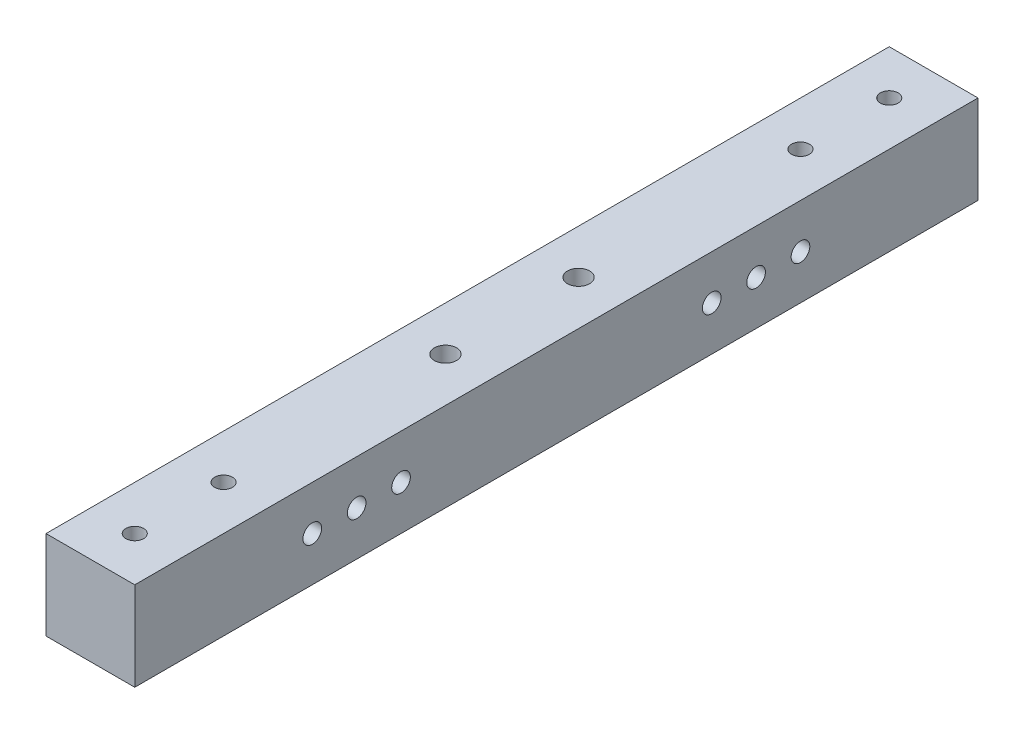
ISO-10303-21;
HEADER;
FILE_DESCRIPTION(('STEP AP214'),'2;1');
FILE_NAME('part.step','',(''),(''),'','','');
FILE_SCHEMA(('AUTOMOTIVE_DESIGN { 1 0 10303 214 1 1 1 1 }'));
ENDSEC;
DATA;
#1=APPLICATION_CONTEXT('core data for automotive mechanical design processes');
#2=APPLICATION_PROTOCOL_DEFINITION('international standard','automotive_design',2000,#1);
#3=PRODUCT_CONTEXT('',#1,'mechanical');
#4=PRODUCT('Part','Part','',(#3));
#5=PRODUCT_RELATED_PRODUCT_CATEGORY('part','',(#4));
#6=PRODUCT_DEFINITION_FORMATION('','',#4);
#7=PRODUCT_DEFINITION_CONTEXT('part definition',#1,'design');
#8=PRODUCT_DEFINITION('design','',#6,#7);
#9=PRODUCT_DEFINITION_SHAPE('','',#8);
#10=(LENGTH_UNIT() NAMED_UNIT(*) SI_UNIT(.MILLI.,.METRE.));
#11=(NAMED_UNIT(*) PLANE_ANGLE_UNIT() SI_UNIT($,.RADIAN.));
#12=(NAMED_UNIT(*) SI_UNIT($,.STERADIAN.) SOLID_ANGLE_UNIT());
#13=UNCERTAINTY_MEASURE_WITH_UNIT(LENGTH_MEASURE(1.E-05),#10,'distance_accuracy_value','');
#14=(GEOMETRIC_REPRESENTATION_CONTEXT(3) GLOBAL_UNCERTAINTY_ASSIGNED_CONTEXT((#13)) GLOBAL_UNIT_ASSIGNED_CONTEXT((#10,
#11,#12)) REPRESENTATION_CONTEXT('',''));
#15=CARTESIAN_POINT('',(0.,0.,0.));
#16=DIRECTION('',(0.,0.,1.));
#17=DIRECTION('',(1.,0.,0.));
#18=AXIS2_PLACEMENT_3D('',#15,#16,#17);
#19=CARTESIAN_POINT('',(0.,0.,190.));
#20=DIRECTION('',(1.,0.,0.));
#21=DIRECTION('',(0.,0.,-1.));
#22=AXIS2_PLACEMENT_3D('',#19,#20,#21);
#23=PLANE('',#22);
#24=CARTESIAN_POINT('',(0.,10.,40.));
#25=DIRECTION('',(1.,0.,0.));
#26=DIRECTION('',(0.,0.,1.));
#27=AXIS2_PLACEMENT_3D('',#24,#25,#26);
#28=CIRCLE('',#27,2.09999999999999);
#29=CARTESIAN_POINT('',(0.,10.,42.1));
#30=VERTEX_POINT('',#29);
#31=EDGE_CURVE('E158',#30,#30,#28,.T.);
#32=ORIENTED_EDGE('',*,*,#31,.T.);
#33=EDGE_LOOP('',(#32));
#34=FACE_BOUND('',#33,.T.);
#35=CARTESIAN_POINT('',(0.,10.,50.));
#36=DIRECTION('',(1.,0.,0.));
#37=DIRECTION('',(0.,0.,1.));
#38=AXIS2_PLACEMENT_3D('',#35,#36,#37);
#39=CIRCLE('',#38,2.09999999999999);
#40=CARTESIAN_POINT('',(0.,10.,52.1));
#41=VERTEX_POINT('',#40);
#42=EDGE_CURVE('E164',#41,#41,#39,.T.);
#43=ORIENTED_EDGE('',*,*,#42,.T.);
#44=EDGE_LOOP('',(#43));
#45=FACE_BOUND('',#44,.T.);
#46=CARTESIAN_POINT('',(0.,10.0000000000002,60.));
#47=DIRECTION('',(1.,0.,0.));
#48=DIRECTION('',(0.,0.,1.));
#49=AXIS2_PLACEMENT_3D('',#46,#47,#48);
#50=CIRCLE('',#49,2.09999999999999);
#51=CARTESIAN_POINT('',(0.,10.0000000000002,62.1));
#52=VERTEX_POINT('',#51);
#53=EDGE_CURVE('E170',#52,#52,#50,.T.);
#54=ORIENTED_EDGE('',*,*,#53,.T.);
#55=EDGE_LOOP('',(#54));
#56=FACE_BOUND('',#55,.T.);
#57=CARTESIAN_POINT('',(0.,10.,150.));
#58=DIRECTION('',(1.,0.,0.));
#59=DIRECTION('',(0.,0.,-1.));
#60=AXIS2_PLACEMENT_3D('',#57,#58,#59);
#61=CIRCLE('',#60,2.09999999999999);
#62=CARTESIAN_POINT('',(0.,10.,147.9));
#63=VERTEX_POINT('',#62);
#64=EDGE_CURVE('E176',#63,#63,#61,.T.);
#65=ORIENTED_EDGE('',*,*,#64,.T.);
#66=EDGE_LOOP('',(#65));
#67=FACE_BOUND('',#66,.T.);
#68=CARTESIAN_POINT('',(0.,10.0000000000001,130.));
#69=DIRECTION('',(1.,0.,0.));
#70=DIRECTION('',(0.,0.,-1.));
#71=AXIS2_PLACEMENT_3D('',#68,#69,#70);
#72=CIRCLE('',#71,2.09999999999999);
#73=CARTESIAN_POINT('',(0.,10.0000000000001,127.9));
#74=VERTEX_POINT('',#73);
#75=EDGE_CURVE('E152',#74,#74,#72,.T.);
#76=ORIENTED_EDGE('',*,*,#75,.T.);
#77=EDGE_LOOP('',(#76));
#78=FACE_BOUND('',#77,.T.);
#79=CARTESIAN_POINT('',(0.,10.,140.));
#80=DIRECTION('',(1.,0.,0.));
#81=DIRECTION('',(0.,0.,-1.));
#82=AXIS2_PLACEMENT_3D('',#79,#80,#81);
#83=CIRCLE('',#82,2.09999999999999);
#84=CARTESIAN_POINT('',(0.,10.,137.9));
#85=VERTEX_POINT('',#84);
#86=EDGE_CURVE('E142',#85,#85,#83,.T.);
#87=ORIENTED_EDGE('',*,*,#86,.T.);
#88=EDGE_LOOP('',(#87));
#89=FACE_BOUND('',#88,.T.);
#90=DIRECTION('',(0.,-1.,0.));
#91=VECTOR('',#90,1.);
#92=CARTESIAN_POINT('',(0.,0.,0.));
#93=LINE('',#92,#91);
#94=CARTESIAN_POINT('',(0.,20.,0.));
#95=VERTEX_POINT('',#94);
#96=CARTESIAN_POINT('',(0.,0.,0.));
#97=VERTEX_POINT('',#96);
#98=EDGE_CURVE('E99',#95,#97,#93,.T.);
#99=ORIENTED_EDGE('',*,*,#98,.T.);
#100=DIRECTION('',(0.,0.,-1.));
#101=VECTOR('',#100,1.);
#102=CARTESIAN_POINT('',(0.,0.,190.));
#103=LINE('',#102,#101);
#104=CARTESIAN_POINT('',(0.,0.,190.));
#105=VERTEX_POINT('',#104);
#106=EDGE_CURVE('E11',#105,#97,#103,.T.);
#107=ORIENTED_EDGE('',*,*,#106,.F.);
#108=DIRECTION('',(0.,-1.,0.));
#109=VECTOR('',#108,1.);
#110=CARTESIAN_POINT('',(0.,0.,190.));
#111=LINE('',#110,#109);
#112=CARTESIAN_POINT('',(0.,20.,190.));
#113=VERTEX_POINT('',#112);
#114=EDGE_CURVE('E87',#113,#105,#111,.T.);
#115=ORIENTED_EDGE('',*,*,#114,.F.);
#116=DIRECTION('',(0.,0.,-1.));
#117=VECTOR('',#116,1.);
#118=CARTESIAN_POINT('',(0.,20.,190.));
#119=LINE('',#118,#117);
#120=EDGE_CURVE('E95',#113,#95,#119,.T.);
#121=ORIENTED_EDGE('',*,*,#120,.T.);
#122=EDGE_LOOP('',(#99,#107,#115,#121));
#123=FACE_BOUND('',#122,.T.);
#124=ADVANCED_FACE('F36',(#34,#45,#56,#67,#78,#89,#123),#23,.F.);
#125=CARTESIAN_POINT('',(0.,0.,190.));
#126=DIRECTION('',(0.,1.,0.));
#127=DIRECTION('',(0.,0.,1.));
#128=AXIS2_PLACEMENT_3D('',#125,#126,#127);
#129=PLANE('',#128);
#130=CARTESIAN_POINT('',(10.,0.,180.));
#131=DIRECTION('',(0.,1.,0.));
#132=DIRECTION('',(0.,0.,1.));
#133=AXIS2_PLACEMENT_3D('',#130,#131,#132);
#134=CIRCLE('',#133,2.);
#135=CARTESIAN_POINT('',(10.,0.,182.));
#136=VERTEX_POINT('',#135);
#137=EDGE_CURVE('E102',#136,#136,#134,.T.);
#138=ORIENTED_EDGE('',*,*,#137,.T.);
#139=EDGE_LOOP('',(#138));
#140=FACE_BOUND('',#139,.T.);
#141=CARTESIAN_POINT('',(10.,0.,80.));
#142=DIRECTION('',(0.,1.,0.));
#143=DIRECTION('',(0.,0.,-1.));
#144=AXIS2_PLACEMENT_3D('',#141,#142,#143);
#145=CIRCLE('',#144,2.5);
#146=CARTESIAN_POINT('',(10.,0.,77.5));
#147=VERTEX_POINT('',#146);
#148=EDGE_CURVE('E117',#147,#147,#145,.T.);
#149=ORIENTED_EDGE('',*,*,#148,.T.);
#150=EDGE_LOOP('',(#149));
#151=FACE_BOUND('',#150,.T.);
#152=CARTESIAN_POINT('',(10.,0.,30.));
#153=DIRECTION('',(0.,1.,0.));
#154=DIRECTION('',(0.,0.,-1.));
#155=AXIS2_PLACEMENT_3D('',#152,#153,#154);
#156=CIRCLE('',#155,2.);
#157=CARTESIAN_POINT('',(10.,0.,28.));
#158=VERTEX_POINT('',#157);
#159=EDGE_CURVE('E116',#158,#158,#156,.T.);
#160=ORIENTED_EDGE('',*,*,#159,.T.);
#161=EDGE_LOOP('',(#160));
#162=FACE_BOUND('',#161,.T.);
#163=CARTESIAN_POINT('',(10.,0.,10.));
#164=DIRECTION('',(0.,1.,0.));
#165=DIRECTION('',(0.,0.,-1.));
#166=AXIS2_PLACEMENT_3D('',#163,#164,#165);
#167=CIRCLE('',#166,2.);
#168=CARTESIAN_POINT('',(10.,0.,8.00000000000001));
#169=VERTEX_POINT('',#168);
#170=EDGE_CURVE('E123',#169,#169,#167,.T.);
#171=ORIENTED_EDGE('',*,*,#170,.T.);
#172=EDGE_LOOP('',(#171));
#173=FACE_BOUND('',#172,.T.);
#174=CARTESIAN_POINT('',(10.,0.,110.));
#175=DIRECTION('',(0.,1.,0.));
#176=DIRECTION('',(0.,0.,1.));
#177=AXIS2_PLACEMENT_3D('',#174,#175,#176);
#178=CIRCLE('',#177,2.5);
#179=CARTESIAN_POINT('',(10.,0.,112.5));
#180=VERTEX_POINT('',#179);
#181=EDGE_CURVE('E129',#180,#180,#178,.T.);
#182=ORIENTED_EDGE('',*,*,#181,.T.);
#183=EDGE_LOOP('',(#182));
#184=FACE_BOUND('',#183,.T.);
#185=CARTESIAN_POINT('',(10.,0.,160.));
#186=DIRECTION('',(0.,1.,0.));
#187=DIRECTION('',(0.,0.,1.));
#188=AXIS2_PLACEMENT_3D('',#185,#186,#187);
#189=CIRCLE('',#188,2.);
#190=CARTESIAN_POINT('',(10.,0.,162.));
#191=VERTEX_POINT('',#190);
#192=EDGE_CURVE('E135',#191,#191,#189,.T.);
#193=ORIENTED_EDGE('',*,*,#192,.T.);
#194=EDGE_LOOP('',(#193));
#195=FACE_BOUND('',#194,.T.);
#196=DIRECTION('',(1.,0.,0.));
#197=VECTOR('',#196,1.);
#198=CARTESIAN_POINT('',(0.,0.,0.));
#199=LINE('',#198,#197);
#200=CARTESIAN_POINT('',(20.,0.,0.));
#201=VERTEX_POINT('',#200);
#202=EDGE_CURVE('E91',#97,#201,#199,.T.);
#203=ORIENTED_EDGE('',*,*,#202,.T.);
#204=DIRECTION('',(0.,0.,-1.));
#205=VECTOR('',#204,1.);
#206=CARTESIAN_POINT('',(20.,0.,190.));
#207=LINE('',#206,#205);
#208=CARTESIAN_POINT('',(20.,0.,190.));
#209=VERTEX_POINT('',#208);
#210=EDGE_CURVE('E44',#209,#201,#207,.T.);
#211=ORIENTED_EDGE('',*,*,#210,.F.);
#212=DIRECTION('',(1.,0.,0.));
#213=VECTOR('',#212,1.);
#214=CARTESIAN_POINT('',(0.,0.,190.));
#215=LINE('',#214,#213);
#216=EDGE_CURVE('E82',#105,#209,#215,.T.);
#217=ORIENTED_EDGE('',*,*,#216,.F.);
#218=ORIENTED_EDGE('',*,*,#106,.T.);
#219=EDGE_LOOP('',(#203,#211,#217,#218));
#220=FACE_BOUND('',#219,.T.);
#221=ADVANCED_FACE('F90',(#140,#151,#162,#173,#184,#195,#220),#129,.F.);
#222=CARTESIAN_POINT('',(20.,0.,190.));
#223=DIRECTION('',(-1.,0.,0.));
#224=DIRECTION('',(0.,0.,1.));
#225=AXIS2_PLACEMENT_3D('',#222,#223,#224);
#226=PLANE('',#225);
#227=CARTESIAN_POINT('',(20.,10.,40.));
#228=DIRECTION('',(1.,0.,0.));
#229=DIRECTION('',(0.,0.,1.));
#230=AXIS2_PLACEMENT_3D('',#227,#228,#229);
#231=CIRCLE('',#230,2.09999999999999);
#232=CARTESIAN_POINT('',(20.,10.,42.1));
#233=VERTEX_POINT('',#232);
#234=EDGE_CURVE('E155',#233,#233,#231,.T.);
#235=ORIENTED_EDGE('',*,*,#234,.F.);
#236=EDGE_LOOP('',(#235));
#237=FACE_BOUND('',#236,.T.);
#238=CARTESIAN_POINT('',(20.,10.,50.));
#239=DIRECTION('',(1.,0.,0.));
#240=DIRECTION('',(0.,0.,1.));
#241=AXIS2_PLACEMENT_3D('',#238,#239,#240);
#242=CIRCLE('',#241,2.09999999999999);
#243=CARTESIAN_POINT('',(20.,10.,52.1));
#244=VERTEX_POINT('',#243);
#245=EDGE_CURVE('E161',#244,#244,#242,.T.);
#246=ORIENTED_EDGE('',*,*,#245,.F.);
#247=EDGE_LOOP('',(#246));
#248=FACE_BOUND('',#247,.T.);
#249=CARTESIAN_POINT('',(20.,10.0000000000002,60.));
#250=DIRECTION('',(1.,0.,0.));
#251=DIRECTION('',(0.,0.,1.));
#252=AXIS2_PLACEMENT_3D('',#249,#250,#251);
#253=CIRCLE('',#252,2.09999999999999);
#254=CARTESIAN_POINT('',(20.,10.0000000000002,62.1));
#255=VERTEX_POINT('',#254);
#256=EDGE_CURVE('E167',#255,#255,#253,.T.);
#257=ORIENTED_EDGE('',*,*,#256,.F.);
#258=EDGE_LOOP('',(#257));
#259=FACE_BOUND('',#258,.T.);
#260=CARTESIAN_POINT('',(20.,10.,150.));
#261=DIRECTION('',(1.,0.,0.));
#262=DIRECTION('',(0.,0.,-1.));
#263=AXIS2_PLACEMENT_3D('',#260,#261,#262);
#264=CIRCLE('',#263,2.09999999999999);
#265=CARTESIAN_POINT('',(20.,10.,147.9));
#266=VERTEX_POINT('',#265);
#267=EDGE_CURVE('E173',#266,#266,#264,.T.);
#268=ORIENTED_EDGE('',*,*,#267,.F.);
#269=EDGE_LOOP('',(#268));
#270=FACE_BOUND('',#269,.T.);
#271=CARTESIAN_POINT('',(20.,10.0000000000001,130.));
#272=DIRECTION('',(1.,0.,0.));
#273=DIRECTION('',(0.,0.,-1.));
#274=AXIS2_PLACEMENT_3D('',#271,#272,#273);
#275=CIRCLE('',#274,2.09999999999999);
#276=CARTESIAN_POINT('',(20.,10.0000000000001,127.9));
#277=VERTEX_POINT('',#276);
#278=EDGE_CURVE('E179',#277,#277,#275,.T.);
#279=ORIENTED_EDGE('',*,*,#278,.F.);
#280=EDGE_LOOP('',(#279));
#281=FACE_BOUND('',#280,.T.);
#282=CARTESIAN_POINT('',(20.,10.,140.));
#283=DIRECTION('',(1.,0.,0.));
#284=DIRECTION('',(0.,0.,-1.));
#285=AXIS2_PLACEMENT_3D('',#282,#283,#284);
#286=CIRCLE('',#285,2.09999999999999);
#287=CARTESIAN_POINT('',(20.,10.,137.9));
#288=VERTEX_POINT('',#287);
#289=EDGE_CURVE('E149',#288,#288,#286,.T.);
#290=ORIENTED_EDGE('',*,*,#289,.F.);
#291=EDGE_LOOP('',(#290));
#292=FACE_BOUND('',#291,.T.);
#293=DIRECTION('',(0.,1.,0.));
#294=VECTOR('',#293,1.);
#295=CARTESIAN_POINT('',(20.,0.,0.));
#296=LINE('',#295,#294);
#297=CARTESIAN_POINT('',(20.,20.,0.));
#298=VERTEX_POINT('',#297);
#299=EDGE_CURVE('E69',#201,#298,#296,.T.);
#300=ORIENTED_EDGE('',*,*,#299,.T.);
#301=DIRECTION('',(0.,0.,-1.));
#302=VECTOR('',#301,1.);
#303=CARTESIAN_POINT('',(20.,20.,190.));
#304=LINE('',#303,#302);
#305=CARTESIAN_POINT('',(20.,20.,190.));
#306=VERTEX_POINT('',#305);
#307=EDGE_CURVE('E92',#306,#298,#304,.T.);
#308=ORIENTED_EDGE('',*,*,#307,.F.);
#309=DIRECTION('',(0.,1.,0.));
#310=VECTOR('',#309,1.);
#311=CARTESIAN_POINT('',(20.,0.,190.));
#312=LINE('',#311,#310);
#313=EDGE_CURVE('E85',#209,#306,#312,.T.);
#314=ORIENTED_EDGE('',*,*,#313,.F.);
#315=ORIENTED_EDGE('',*,*,#210,.T.);
#316=EDGE_LOOP('',(#300,#308,#314,#315));
#317=FACE_BOUND('',#316,.T.);
#318=ADVANCED_FACE('F93',(#237,#248,#259,#270,#281,#292,#317),#226,.F.);
#319=CARTESIAN_POINT('',(0.,20.,190.));
#320=DIRECTION('',(0.,-1.,0.));
#321=DIRECTION('',(0.,0.,-1.));
#322=AXIS2_PLACEMENT_3D('',#319,#320,#321);
#323=PLANE('',#322);
#324=CARTESIAN_POINT('',(10.,20.,180.));
#325=DIRECTION('',(0.,1.,0.));
#326=DIRECTION('',(0.,0.,1.));
#327=AXIS2_PLACEMENT_3D('',#324,#325,#326);
#328=CIRCLE('',#327,2.);
#329=CARTESIAN_POINT('',(10.,20.,182.));
#330=VERTEX_POINT('',#329);
#331=EDGE_CURVE('E138',#330,#330,#328,.T.);
#332=ORIENTED_EDGE('',*,*,#331,.F.);
#333=EDGE_LOOP('',(#332));
#334=FACE_BOUND('',#333,.T.);
#335=CARTESIAN_POINT('',(10.,20.,80.));
#336=DIRECTION('',(0.,1.,0.));
#337=DIRECTION('',(0.,0.,-1.));
#338=AXIS2_PLACEMENT_3D('',#335,#336,#337);
#339=CIRCLE('',#338,2.5);
#340=CARTESIAN_POINT('',(10.,20.,77.5));
#341=VERTEX_POINT('',#340);
#342=EDGE_CURVE('E139',#341,#341,#339,.T.);
#343=ORIENTED_EDGE('',*,*,#342,.F.);
#344=EDGE_LOOP('',(#343));
#345=FACE_BOUND('',#344,.T.);
#346=CARTESIAN_POINT('',(10.,20.,30.));
#347=DIRECTION('',(0.,1.,0.));
#348=DIRECTION('',(0.,0.,-1.));
#349=AXIS2_PLACEMENT_3D('',#346,#347,#348);
#350=CIRCLE('',#349,2.);
#351=CARTESIAN_POINT('',(10.,20.,28.));
#352=VERTEX_POINT('',#351);
#353=EDGE_CURVE('E113',#352,#352,#350,.T.);
#354=ORIENTED_EDGE('',*,*,#353,.F.);
#355=EDGE_LOOP('',(#354));
#356=FACE_BOUND('',#355,.T.);
#357=CARTESIAN_POINT('',(10.,20.,10.));
#358=DIRECTION('',(0.,1.,0.));
#359=DIRECTION('',(0.,0.,-1.));
#360=AXIS2_PLACEMENT_3D('',#357,#358,#359);
#361=CIRCLE('',#360,2.);
#362=CARTESIAN_POINT('',(10.,20.,8.00000000000001));
#363=VERTEX_POINT('',#362);
#364=EDGE_CURVE('E120',#363,#363,#361,.T.);
#365=ORIENTED_EDGE('',*,*,#364,.F.);
#366=EDGE_LOOP('',(#365));
#367=FACE_BOUND('',#366,.T.);
#368=CARTESIAN_POINT('',(10.,20.,110.));
#369=DIRECTION('',(0.,1.,0.));
#370=DIRECTION('',(0.,0.,1.));
#371=AXIS2_PLACEMENT_3D('',#368,#369,#370);
#372=CIRCLE('',#371,2.5);
#373=CARTESIAN_POINT('',(10.,20.,112.5));
#374=VERTEX_POINT('',#373);
#375=EDGE_CURVE('E126',#374,#374,#372,.T.);
#376=ORIENTED_EDGE('',*,*,#375,.F.);
#377=EDGE_LOOP('',(#376));
#378=FACE_BOUND('',#377,.T.);
#379=CARTESIAN_POINT('',(10.,20.,160.));
#380=DIRECTION('',(0.,1.,0.));
#381=DIRECTION('',(0.,0.,1.));
#382=AXIS2_PLACEMENT_3D('',#379,#380,#381);
#383=CIRCLE('',#382,2.);
#384=CARTESIAN_POINT('',(10.,20.,162.));
#385=VERTEX_POINT('',#384);
#386=EDGE_CURVE('E132',#385,#385,#383,.T.);
#387=ORIENTED_EDGE('',*,*,#386,.F.);
#388=EDGE_LOOP('',(#387));
#389=FACE_BOUND('',#388,.T.);
#390=DIRECTION('',(-1.,0.,0.));
#391=VECTOR('',#390,1.);
#392=CARTESIAN_POINT('',(0.,20.,0.));
#393=LINE('',#392,#391);
#394=EDGE_CURVE('E75',#298,#95,#393,.T.);
#395=ORIENTED_EDGE('',*,*,#394,.T.);
#396=ORIENTED_EDGE('',*,*,#120,.F.);
#397=DIRECTION('',(-1.,0.,0.));
#398=VECTOR('',#397,1.);
#399=CARTESIAN_POINT('',(0.,20.,190.));
#400=LINE('',#399,#398);
#401=EDGE_CURVE('E52',#306,#113,#400,.T.);
#402=ORIENTED_EDGE('',*,*,#401,.F.);
#403=ORIENTED_EDGE('',*,*,#307,.T.);
#404=EDGE_LOOP('',(#395,#396,#402,#403));
#405=FACE_BOUND('',#404,.T.);
#406=ADVANCED_FACE('F107',(#334,#345,#356,#367,#378,#389,#405),#323,.F.);
#407=CARTESIAN_POINT('',(0.,0.,190.));
#408=DIRECTION('',(0.,0.,-1.));
#409=DIRECTION('',(-1.,0.,0.));
#410=AXIS2_PLACEMENT_3D('',#407,#408,#409);
#411=PLANE('',#410);
#412=ORIENTED_EDGE('',*,*,#114,.T.);
#413=ORIENTED_EDGE('',*,*,#216,.T.);
#414=ORIENTED_EDGE('',*,*,#313,.T.);
#415=ORIENTED_EDGE('',*,*,#401,.T.);
#416=EDGE_LOOP('',(#412,#413,#414,#415));
#417=FACE_BOUND('',#416,.T.);
#418=ADVANCED_FACE('F83',(#417),#411,.F.);
#419=CARTESIAN_POINT('',(0.,0.,0.));
#420=DIRECTION('',(0.,0.,-1.));
#421=DIRECTION('',(-1.,0.,0.));
#422=AXIS2_PLACEMENT_3D('',#419,#420,#421);
#423=PLANE('',#422);
#424=ORIENTED_EDGE('',*,*,#98,.F.);
#425=ORIENTED_EDGE('',*,*,#394,.F.);
#426=ORIENTED_EDGE('',*,*,#299,.F.);
#427=ORIENTED_EDGE('',*,*,#202,.F.);
#428=EDGE_LOOP('',(#424,#425,#426,#427));
#429=FACE_BOUND('',#428,.T.);
#430=ADVANCED_FACE('F110',(#429),#423,.T.);
#431=CARTESIAN_POINT('',(10.,0.,160.));
#432=DIRECTION('',(0.,1.,0.));
#433=DIRECTION('',(0.,0.,1.));
#434=AXIS2_PLACEMENT_3D('',#431,#432,#433);
#435=CYLINDRICAL_SURFACE('',#434,2.);
#436=ORIENTED_EDGE('',*,*,#192,.F.);
#437=EDGE_LOOP('',(#436));
#438=FACE_BOUND('',#437,.T.);
#439=ORIENTED_EDGE('',*,*,#386,.T.);
#440=EDGE_LOOP('',(#439));
#441=FACE_BOUND('',#440,.T.);
#442=ADVANCED_FACE('F310',(#438,#441),#435,.F.);
#443=CARTESIAN_POINT('',(10.,0.,110.));
#444=DIRECTION('',(0.,1.,0.));
#445=DIRECTION('',(0.,0.,1.));
#446=AXIS2_PLACEMENT_3D('',#443,#444,#445);
#447=CYLINDRICAL_SURFACE('',#446,2.5);
#448=ORIENTED_EDGE('',*,*,#181,.F.);
#449=EDGE_LOOP('',(#448));
#450=FACE_BOUND('',#449,.T.);
#451=ORIENTED_EDGE('',*,*,#375,.T.);
#452=EDGE_LOOP('',(#451));
#453=FACE_BOUND('',#452,.T.);
#454=ADVANCED_FACE('F316',(#450,#453),#447,.F.);
#455=CARTESIAN_POINT('',(10.,0.,10.));
#456=DIRECTION('',(0.,1.,0.));
#457=DIRECTION('',(0.,0.,1.));
#458=AXIS2_PLACEMENT_3D('',#455,#456,#457);
#459=CYLINDRICAL_SURFACE('',#458,2.);
#460=ORIENTED_EDGE('',*,*,#170,.F.);
#461=EDGE_LOOP('',(#460));
#462=FACE_BOUND('',#461,.T.);
#463=ORIENTED_EDGE('',*,*,#364,.T.);
#464=EDGE_LOOP('',(#463));
#465=FACE_BOUND('',#464,.T.);
#466=ADVANCED_FACE('F324',(#462,#465),#459,.F.);
#467=CARTESIAN_POINT('',(10.,0.,30.));
#468=DIRECTION('',(0.,1.,0.));
#469=DIRECTION('',(0.,0.,1.));
#470=AXIS2_PLACEMENT_3D('',#467,#468,#469);
#471=CYLINDRICAL_SURFACE('',#470,2.);
#472=ORIENTED_EDGE('',*,*,#159,.F.);
#473=EDGE_LOOP('',(#472));
#474=FACE_BOUND('',#473,.T.);
#475=ORIENTED_EDGE('',*,*,#353,.T.);
#476=EDGE_LOOP('',(#475));
#477=FACE_BOUND('',#476,.T.);
#478=ADVANCED_FACE('F332',(#474,#477),#471,.F.);
#479=CARTESIAN_POINT('',(10.,0.,80.));
#480=DIRECTION('',(0.,1.,0.));
#481=DIRECTION('',(0.,0.,1.));
#482=AXIS2_PLACEMENT_3D('',#479,#480,#481);
#483=CYLINDRICAL_SURFACE('',#482,2.5);
#484=ORIENTED_EDGE('',*,*,#148,.F.);
#485=EDGE_LOOP('',(#484));
#486=FACE_BOUND('',#485,.T.);
#487=ORIENTED_EDGE('',*,*,#342,.T.);
#488=EDGE_LOOP('',(#487));
#489=FACE_BOUND('',#488,.T.);
#490=ADVANCED_FACE('F208',(#486,#489),#483,.F.);
#491=CARTESIAN_POINT('',(10.,0.,180.));
#492=DIRECTION('',(0.,1.,0.));
#493=DIRECTION('',(0.,0.,1.));
#494=AXIS2_PLACEMENT_3D('',#491,#492,#493);
#495=CYLINDRICAL_SURFACE('',#494,2.);
#496=ORIENTED_EDGE('',*,*,#137,.F.);
#497=EDGE_LOOP('',(#496));
#498=FACE_BOUND('',#497,.T.);
#499=ORIENTED_EDGE('',*,*,#331,.T.);
#500=EDGE_LOOP('',(#499));
#501=FACE_BOUND('',#500,.T.);
#502=ADVANCED_FACE('F202',(#498,#501),#495,.F.);
#503=CARTESIAN_POINT('',(0.,10.,140.));
#504=DIRECTION('',(1.,0.,0.));
#505=DIRECTION('',(0.,0.,-1.));
#506=AXIS2_PLACEMENT_3D('',#503,#504,#505);
#507=CYLINDRICAL_SURFACE('',#506,2.09999999999999);
#508=ORIENTED_EDGE('',*,*,#86,.F.);
#509=EDGE_LOOP('',(#508));
#510=FACE_BOUND('',#509,.T.);
#511=ORIENTED_EDGE('',*,*,#289,.T.);
#512=EDGE_LOOP('',(#511));
#513=FACE_BOUND('',#512,.T.);
#514=ADVANCED_FACE('F191',(#510,#513),#507,.F.);
#515=CARTESIAN_POINT('',(0.,10.0000000000001,130.));
#516=DIRECTION('',(1.,0.,0.));
#517=DIRECTION('',(0.,0.,-1.));
#518=AXIS2_PLACEMENT_3D('',#515,#516,#517);
#519=CYLINDRICAL_SURFACE('',#518,2.09999999999999);
#520=ORIENTED_EDGE('',*,*,#75,.F.);
#521=EDGE_LOOP('',(#520));
#522=FACE_BOUND('',#521,.T.);
#523=ORIENTED_EDGE('',*,*,#278,.T.);
#524=EDGE_LOOP('',(#523));
#525=FACE_BOUND('',#524,.T.);
#526=ADVANCED_FACE('F187',(#522,#525),#519,.F.);
#527=CARTESIAN_POINT('',(0.,10.,150.));
#528=DIRECTION('',(1.,0.,0.));
#529=DIRECTION('',(0.,0.,-1.));
#530=AXIS2_PLACEMENT_3D('',#527,#528,#529);
#531=CYLINDRICAL_SURFACE('',#530,2.09999999999999);
#532=ORIENTED_EDGE('',*,*,#64,.F.);
#533=EDGE_LOOP('',(#532));
#534=FACE_BOUND('',#533,.T.);
#535=ORIENTED_EDGE('',*,*,#267,.T.);
#536=EDGE_LOOP('',(#535));
#537=FACE_BOUND('',#536,.T.);
#538=ADVANCED_FACE('F190',(#534,#537),#531,.F.);
#539=CARTESIAN_POINT('',(0.,10.0000000000002,60.));
#540=DIRECTION('',(1.,0.,0.));
#541=DIRECTION('',(0.,0.,-1.));
#542=AXIS2_PLACEMENT_3D('',#539,#540,#541);
#543=CYLINDRICAL_SURFACE('',#542,2.09999999999999);
#544=ORIENTED_EDGE('',*,*,#53,.F.);
#545=EDGE_LOOP('',(#544));
#546=FACE_BOUND('',#545,.T.);
#547=ORIENTED_EDGE('',*,*,#256,.T.);
#548=EDGE_LOOP('',(#547));
#549=FACE_BOUND('',#548,.T.);
#550=ADVANCED_FACE('F230',(#546,#549),#543,.F.);
#551=CARTESIAN_POINT('',(0.,10.,50.));
#552=DIRECTION('',(1.,0.,0.));
#553=DIRECTION('',(0.,0.,-1.));
#554=AXIS2_PLACEMENT_3D('',#551,#552,#553);
#555=CYLINDRICAL_SURFACE('',#554,2.09999999999999);
#556=ORIENTED_EDGE('',*,*,#42,.F.);
#557=EDGE_LOOP('',(#556));
#558=FACE_BOUND('',#557,.T.);
#559=ORIENTED_EDGE('',*,*,#245,.T.);
#560=EDGE_LOOP('',(#559));
#561=FACE_BOUND('',#560,.T.);
#562=ADVANCED_FACE('F237',(#558,#561),#555,.F.);
#563=CARTESIAN_POINT('',(0.,10.,40.));
#564=DIRECTION('',(1.,0.,0.));
#565=DIRECTION('',(0.,0.,-1.));
#566=AXIS2_PLACEMENT_3D('',#563,#564,#565);
#567=CYLINDRICAL_SURFACE('',#566,2.09999999999999);
#568=ORIENTED_EDGE('',*,*,#31,.F.);
#569=EDGE_LOOP('',(#568));
#570=FACE_BOUND('',#569,.T.);
#571=ORIENTED_EDGE('',*,*,#234,.T.);
#572=EDGE_LOOP('',(#571));
#573=FACE_BOUND('',#572,.T.);
#574=ADVANCED_FACE('F242',(#570,#573),#567,.F.);
#575=CLOSED_SHELL('',(#124,#221,#318,#406,#418,#430,#442,#454,#466,#478,#490,#502,#514,#526,
#538,#550,#562,#574));
#576=MANIFOLD_SOLID_BREP('B2',#575);
#577=ADVANCED_BREP_SHAPE_REPRESENTATION('',(#18,#576),#14);
#578=SHAPE_DEFINITION_REPRESENTATION(#9,#577);
ENDSEC;
END-ISO-10303-21;
